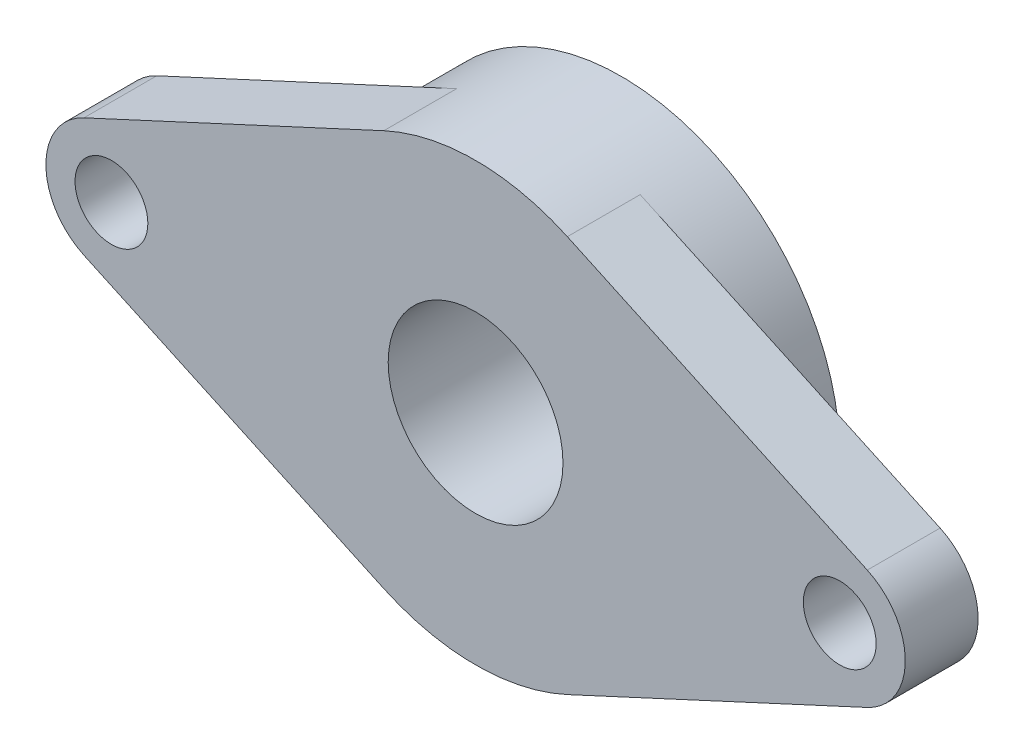
ISO-10303-21;
HEADER;
FILE_DESCRIPTION(('STEP AP214'),'2;1');
FILE_NAME('part.step','',(''),(''),'','','');
FILE_SCHEMA(('AUTOMOTIVE_DESIGN { 1 0 10303 214 1 1 1 1 }'));
ENDSEC;
DATA;
#1=APPLICATION_CONTEXT('core data for automotive mechanical design processes');
#2=APPLICATION_PROTOCOL_DEFINITION('international standard','automotive_design',2000,#1);
#3=PRODUCT_CONTEXT('',#1,'mechanical');
#4=PRODUCT('Part','Part','',(#3));
#5=PRODUCT_RELATED_PRODUCT_CATEGORY('part','',(#4));
#6=PRODUCT_DEFINITION_FORMATION('','',#4);
#7=PRODUCT_DEFINITION_CONTEXT('part definition',#1,'design');
#8=PRODUCT_DEFINITION('design','',#6,#7);
#9=PRODUCT_DEFINITION_SHAPE('','',#8);
#10=(LENGTH_UNIT() NAMED_UNIT(*) SI_UNIT(.MILLI.,.METRE.));
#11=(NAMED_UNIT(*) PLANE_ANGLE_UNIT() SI_UNIT($,.RADIAN.));
#12=(NAMED_UNIT(*) SI_UNIT($,.STERADIAN.) SOLID_ANGLE_UNIT());
#13=UNCERTAINTY_MEASURE_WITH_UNIT(LENGTH_MEASURE(1.E-05),#10,'distance_accuracy_value','');
#14=(GEOMETRIC_REPRESENTATION_CONTEXT(3) GLOBAL_UNCERTAINTY_ASSIGNED_CONTEXT((#13)) GLOBAL_UNIT_ASSIGNED_CONTEXT((#10,
#11,#12)) REPRESENTATION_CONTEXT('',''));
#15=CARTESIAN_POINT('',(0.,0.,0.));
#16=DIRECTION('',(0.,0.,1.));
#17=DIRECTION('',(1.,0.,0.));
#18=AXIS2_PLACEMENT_3D('',#15,#16,#17);
#19=CARTESIAN_POINT('',(0.,0.,0.201945205760562));
#20=DIRECTION('',(0.,0.,1.));
#21=DIRECTION('',(1.,0.,0.));
#22=AXIS2_PLACEMENT_3D('',#19,#20,#21);
#23=PLANE('',#22);
#24=CARTESIAN_POINT('',(0.,0.,0.201945205760562));
#25=DIRECTION('',(0.,0.,-1.));
#26=DIRECTION('',(-1.,0.,0.));
#27=AXIS2_PLACEMENT_3D('',#24,#25,#26);
#28=CIRCLE('',#27,10.);
#29=CARTESIAN_POINT('',(4.2,9.07524104363074,0.201945205760562));
#30=VERTEX_POINT('',#29);
#31=CARTESIAN_POINT('',(4.2,-9.07524104363074,0.201945205760562));
#32=VERTEX_POINT('',#31);
#33=EDGE_CURVE('E11',#30,#32,#28,.T.);
#34=ORIENTED_EDGE('',*,*,#33,.F.);
#35=DIRECTION('',(-0.907524104363074,0.42,0.));
#36=VECTOR('',#35,1.);
#37=CARTESIAN_POINT('',(4.2,9.07524104363074,0.201945205760562));
#38=LINE('',#37,#36);
#39=CARTESIAN_POINT('',(17.9266666666667,2.72257231308922,0.201945205760562));
#40=VERTEX_POINT('',#39);
#41=EDGE_CURVE('E155',#40,#30,#38,.T.);
#42=ORIENTED_EDGE('',*,*,#41,.F.);
#43=CARTESIAN_POINT('',(16.6666666666667,0.,0.201945205760562));
#44=DIRECTION('',(0.,0.,1.));
#45=DIRECTION('',(1.,0.,0.));
#46=AXIS2_PLACEMENT_3D('',#43,#44,#45);
#47=CIRCLE('',#46,3.);
#48=CARTESIAN_POINT('',(17.9266666666667,-2.72257231308922,0.201945205760562));
#49=VERTEX_POINT('',#48);
#50=EDGE_CURVE('E114',#40,#49,#47,.F.);
#51=ORIENTED_EDGE('',*,*,#50,.T.);
#52=DIRECTION('',(-0.907524104363074,-0.42,0.));
#53=VECTOR('',#52,1.);
#54=CARTESIAN_POINT('',(4.2,-9.07524104363074,0.201945205760562));
#55=LINE('',#54,#53);
#56=EDGE_CURVE('E152',#49,#32,#55,.T.);
#57=ORIENTED_EDGE('',*,*,#56,.T.);
#58=EDGE_LOOP('',(#34,#42,#51,#57));
#59=FACE_BOUND('',#58,.T.);
#60=CARTESIAN_POINT('',(16.6666666666667,0.,0.201945205760562));
#61=DIRECTION('',(0.,0.,1.));
#62=DIRECTION('',(1.,0.,0.));
#63=AXIS2_PLACEMENT_3D('',#60,#61,#62);
#64=CIRCLE('',#63,1.66666666666667);
#65=CARTESIAN_POINT('',(18.3333333333333,0.,0.201945205760562));
#66=VERTEX_POINT('',#65);
#67=EDGE_CURVE('E160',#66,#66,#64,.F.);
#68=ORIENTED_EDGE('',*,*,#67,.F.);
#69=EDGE_LOOP('',(#68));
#70=FACE_BOUND('',#69,.T.);
#71=ADVANCED_FACE('F36',(#59,#70),#23,.F.);
#72=CARTESIAN_POINT('',(-4.2,9.07524104363074,3.53527853909389));
#73=DIRECTION('',(-0.42,0.907524104363074,0.));
#74=DIRECTION('',(-0.907524104363074,-0.42,0.));
#75=AXIS2_PLACEMENT_3D('',#72,#73,#74);
#76=PLANE('',#75);
#77=DIRECTION('',(0.907524104363074,0.42,0.));
#78=VECTOR('',#77,1.);
#79=CARTESIAN_POINT('',(-4.2,9.07524104363074,0.201945205760562));
#80=LINE('',#79,#78);
#81=CARTESIAN_POINT('',(-17.9266666666667,2.72257231308922,0.201945205760562));
#82=VERTEX_POINT('',#81);
#83=CARTESIAN_POINT('',(-4.2,9.07524104363074,0.201945205760562));
#84=VERTEX_POINT('',#83);
#85=EDGE_CURVE('E143',#82,#84,#80,.T.);
#86=ORIENTED_EDGE('',*,*,#85,.F.);
#87=DIRECTION('',(0.,0.,-1.));
#88=VECTOR('',#87,1.);
#89=CARTESIAN_POINT('',(-17.9266666666667,2.72257231308922,3.53527853909389));
#90=LINE('',#89,#88);
#91=CARTESIAN_POINT('',(-17.9266666666667,2.72257231308922,3.53527853909389));
#92=VERTEX_POINT('',#91);
#93=EDGE_CURVE('E40',#92,#82,#90,.T.);
#94=ORIENTED_EDGE('',*,*,#93,.F.);
#95=DIRECTION('',(0.907524104363074,0.42,0.));
#96=VECTOR('',#95,1.);
#97=CARTESIAN_POINT('',(-4.2,9.07524104363074,3.53527853909389));
#98=LINE('',#97,#96);
#99=CARTESIAN_POINT('',(-4.2,9.07524104363074,3.53527853909389));
#100=VERTEX_POINT('',#99);
#101=EDGE_CURVE('E163',#92,#100,#98,.T.);
#102=ORIENTED_EDGE('',*,*,#101,.T.);
#103=DIRECTION('',(0.,0.,-1.));
#104=VECTOR('',#103,1.);
#105=CARTESIAN_POINT('',(-4.2,9.07524104363074,3.53527853909389));
#106=LINE('',#105,#104);
#107=EDGE_CURVE('E142',#100,#84,#106,.T.);
#108=ORIENTED_EDGE('',*,*,#107,.T.);
#109=EDGE_LOOP('',(#86,#94,#102,#108));
#110=FACE_BOUND('',#109,.T.);
#111=ADVANCED_FACE('F38',(#110),#76,.T.);
#112=CARTESIAN_POINT('',(-16.6666666666667,0.,3.53527853909389));
#113=DIRECTION('',(0.,0.,-1.));
#114=DIRECTION('',(-1.,0.,0.));
#115=AXIS2_PLACEMENT_3D('',#112,#113,#114);
#116=CYLINDRICAL_SURFACE('',#115,3.);
#117=CARTESIAN_POINT('',(-16.6666666666667,0.,0.201945205760562));
#118=DIRECTION('',(0.,0.,1.));
#119=DIRECTION('',(1.,0.,0.));
#120=AXIS2_PLACEMENT_3D('',#117,#118,#119);
#121=CIRCLE('',#120,3.);
#122=CARTESIAN_POINT('',(-17.9266666666667,-2.72257231308922,0.201945205760562));
#123=VERTEX_POINT('',#122);
#124=EDGE_CURVE('E146',#82,#123,#121,.T.);
#125=ORIENTED_EDGE('',*,*,#124,.T.);
#126=DIRECTION('',(0.,0.,-1.));
#127=VECTOR('',#126,1.);
#128=CARTESIAN_POINT('',(-17.9266666666667,-2.72257231308922,3.53527853909389));
#129=LINE('',#128,#127);
#130=CARTESIAN_POINT('',(-17.9266666666667,-2.72257231308922,3.53527853909389));
#131=VERTEX_POINT('',#130);
#132=EDGE_CURVE('E172',#131,#123,#129,.T.);
#133=ORIENTED_EDGE('',*,*,#132,.F.);
#134=CARTESIAN_POINT('',(-16.6666666666667,0.,3.53527853909389));
#135=DIRECTION('',(0.,0.,1.));
#136=DIRECTION('',(1.,0.,0.));
#137=AXIS2_PLACEMENT_3D('',#134,#135,#136);
#138=CIRCLE('',#137,3.);
#139=EDGE_CURVE('E186',#92,#131,#138,.T.);
#140=ORIENTED_EDGE('',*,*,#139,.F.);
#141=ORIENTED_EDGE('',*,*,#93,.T.);
#142=EDGE_LOOP('',(#125,#133,#140,#141));
#143=FACE_BOUND('',#142,.T.);
#144=ADVANCED_FACE('F198',(#143),#116,.T.);
#145=CARTESIAN_POINT('',(-4.2,-9.07524104363074,3.53527853909389));
#146=DIRECTION('',(0.42,0.907524104363074,0.));
#147=DIRECTION('',(-0.907524104363074,0.42,0.));
#148=AXIS2_PLACEMENT_3D('',#145,#146,#147);
#149=PLANE('',#148);
#150=DIRECTION('',(0.907524104363074,-0.42,0.));
#151=VECTOR('',#150,1.);
#152=CARTESIAN_POINT('',(-4.2,-9.07524104363074,0.201945205760562));
#153=LINE('',#152,#151);
#154=CARTESIAN_POINT('',(-4.2,-9.07524104363074,0.201945205760562));
#155=VERTEX_POINT('',#154);
#156=EDGE_CURVE('E149',#123,#155,#153,.T.);
#157=ORIENTED_EDGE('',*,*,#156,.T.);
#158=DIRECTION('',(0.,0.,-1.));
#159=VECTOR('',#158,1.);
#160=CARTESIAN_POINT('',(-4.2,-9.07524104363074,3.53527853909389));
#161=LINE('',#160,#159);
#162=CARTESIAN_POINT('',(-4.2,-9.07524104363074,3.53527853909389));
#163=VERTEX_POINT('',#162);
#164=EDGE_CURVE('E170',#163,#155,#161,.T.);
#165=ORIENTED_EDGE('',*,*,#164,.F.);
#166=DIRECTION('',(0.907524104363074,-0.42,0.));
#167=VECTOR('',#166,1.);
#168=CARTESIAN_POINT('',(-4.2,-9.07524104363074,3.53527853909389));
#169=LINE('',#168,#167);
#170=EDGE_CURVE('E188',#131,#163,#169,.T.);
#171=ORIENTED_EDGE('',*,*,#170,.F.);
#172=ORIENTED_EDGE('',*,*,#132,.T.);
#173=EDGE_LOOP('',(#157,#165,#171,#172));
#174=FACE_BOUND('',#173,.T.);
#175=ADVANCED_FACE('F199',(#174),#149,.F.);
#176=CARTESIAN_POINT('',(4.2,-9.07524104363074,3.53527853909389));
#177=DIRECTION('',(0.42,-0.907524104363074,0.));
#178=DIRECTION('',(0.907524104363074,0.42,0.));
#179=AXIS2_PLACEMENT_3D('',#176,#177,#178);
#180=PLANE('',#179);
#181=ORIENTED_EDGE('',*,*,#56,.F.);
#182=DIRECTION('',(0.,0.,-1.));
#183=VECTOR('',#182,1.);
#184=CARTESIAN_POINT('',(17.9266666666667,-2.72257231308922,3.53527853909389));
#185=LINE('',#184,#183);
#186=CARTESIAN_POINT('',(17.9266666666667,-2.72257231308922,3.53527853909389));
#187=VERTEX_POINT('',#186);
#188=EDGE_CURVE('E115',#187,#49,#185,.T.);
#189=ORIENTED_EDGE('',*,*,#188,.F.);
#190=DIRECTION('',(-0.907524104363074,-0.42,0.));
#191=VECTOR('',#190,1.);
#192=CARTESIAN_POINT('',(4.2,-9.07524104363074,3.53527853909389));
#193=LINE('',#192,#191);
#194=CARTESIAN_POINT('',(4.2,-9.07524104363074,3.53527853909389));
#195=VERTEX_POINT('',#194);
#196=EDGE_CURVE('E127',#187,#195,#193,.T.);
#197=ORIENTED_EDGE('',*,*,#196,.T.);
#198=DIRECTION('',(0.,0.,-1.));
#199=VECTOR('',#198,1.);
#200=CARTESIAN_POINT('',(4.2,-9.07524104363074,3.53527853909389));
#201=LINE('',#200,#199);
#202=EDGE_CURVE('E168',#195,#32,#201,.T.);
#203=ORIENTED_EDGE('',*,*,#202,.T.);
#204=EDGE_LOOP('',(#181,#189,#197,#203));
#205=FACE_BOUND('',#204,.T.);
#206=ADVANCED_FACE('F196',(#205),#180,.T.);
#207=CARTESIAN_POINT('',(16.6666666666667,0.,3.53527853909389));
#208=DIRECTION('',(0.,0.,-1.));
#209=DIRECTION('',(-1.,0.,0.));
#210=AXIS2_PLACEMENT_3D('',#207,#208,#209);
#211=CYLINDRICAL_SURFACE('',#210,3.);
#212=ORIENTED_EDGE('',*,*,#50,.F.);
#213=DIRECTION('',(0.,0.,-1.));
#214=VECTOR('',#213,1.);
#215=CARTESIAN_POINT('',(17.9266666666667,2.72257231308922,3.53527853909389));
#216=LINE('',#215,#214);
#217=CARTESIAN_POINT('',(17.9266666666667,2.72257231308922,3.53527853909389));
#218=VERTEX_POINT('',#217);
#219=EDGE_CURVE('E82',#218,#40,#216,.T.);
#220=ORIENTED_EDGE('',*,*,#219,.F.);
#221=CARTESIAN_POINT('',(16.6666666666667,0.,3.53527853909389));
#222=DIRECTION('',(0.,0.,1.));
#223=DIRECTION('',(1.,0.,0.));
#224=AXIS2_PLACEMENT_3D('',#221,#222,#223);
#225=CIRCLE('',#224,3.);
#226=EDGE_CURVE('E112',#218,#187,#225,.F.);
#227=ORIENTED_EDGE('',*,*,#226,.T.);
#228=ORIENTED_EDGE('',*,*,#188,.T.);
#229=EDGE_LOOP('',(#212,#220,#227,#228));
#230=FACE_BOUND('',#229,.T.);
#231=ADVANCED_FACE('F110',(#230),#211,.T.);
#232=CARTESIAN_POINT('',(4.2,9.07524104363074,3.53527853909389));
#233=DIRECTION('',(-0.42,-0.907524104363074,0.));
#234=DIRECTION('',(0.907524104363074,-0.42,0.));
#235=AXIS2_PLACEMENT_3D('',#232,#233,#234);
#236=PLANE('',#235);
#237=ORIENTED_EDGE('',*,*,#41,.T.);
#238=DIRECTION('',(0.,0.,-1.));
#239=VECTOR('',#238,1.);
#240=CARTESIAN_POINT('',(4.2,9.07524104363074,3.53527853909389));
#241=LINE('',#240,#239);
#242=CARTESIAN_POINT('',(4.2,9.07524104363074,3.53527853909389));
#243=VERTEX_POINT('',#242);
#244=EDGE_CURVE('E116',#243,#30,#241,.T.);
#245=ORIENTED_EDGE('',*,*,#244,.F.);
#246=DIRECTION('',(-0.907524104363074,0.42,0.));
#247=VECTOR('',#246,1.);
#248=CARTESIAN_POINT('',(4.2,9.07524104363074,3.53527853909389));
#249=LINE('',#248,#247);
#250=EDGE_CURVE('E119',#218,#243,#249,.T.);
#251=ORIENTED_EDGE('',*,*,#250,.F.);
#252=ORIENTED_EDGE('',*,*,#219,.T.);
#253=EDGE_LOOP('',(#237,#245,#251,#252));
#254=FACE_BOUND('',#253,.T.);
#255=ADVANCED_FACE('F120',(#254),#236,.F.);
#256=CARTESIAN_POINT('',(-16.6666666666667,0.,3.53527853909389));
#257=DIRECTION('',(0.,0.,-1.));
#258=DIRECTION('',(-1.,0.,0.));
#259=AXIS2_PLACEMENT_3D('',#256,#257,#258);
#260=CYLINDRICAL_SURFACE('',#259,1.66666666666667);
#261=CARTESIAN_POINT('',(-16.6666666666667,0.,3.53527853909389));
#262=DIRECTION('',(0.,0.,1.));
#263=DIRECTION('',(1.,0.,0.));
#264=AXIS2_PLACEMENT_3D('',#261,#262,#263);
#265=CIRCLE('',#264,1.66666666666667);
#266=CARTESIAN_POINT('',(-15.,0.,3.53527853909389));
#267=VERTEX_POINT('',#266);
#268=EDGE_CURVE('E136',#267,#267,#265,.T.);
#269=ORIENTED_EDGE('',*,*,#268,.T.);
#270=EDGE_LOOP('',(#269));
#271=FACE_BOUND('',#270,.T.);
#272=CARTESIAN_POINT('',(-16.6666666666667,0.,0.201945205760562));
#273=DIRECTION('',(0.,0.,1.));
#274=DIRECTION('',(1.,0.,0.));
#275=AXIS2_PLACEMENT_3D('',#272,#273,#274);
#276=CIRCLE('',#275,1.66666666666667);
#277=CARTESIAN_POINT('',(-15.,0.,0.201945205760562));
#278=VERTEX_POINT('',#277);
#279=EDGE_CURVE('E157',#278,#278,#276,.T.);
#280=ORIENTED_EDGE('',*,*,#279,.F.);
#281=EDGE_LOOP('',(#280));
#282=FACE_BOUND('',#281,.T.);
#283=ADVANCED_FACE('F208',(#271,#282),#260,.F.);
#284=CARTESIAN_POINT('',(0.,0.,3.53527853909389));
#285=DIRECTION('',(0.,0.,-1.));
#286=DIRECTION('',(-1.,0.,0.));
#287=AXIS2_PLACEMENT_3D('',#284,#285,#286);
#288=CYLINDRICAL_SURFACE('',#287,4.);
#289=CARTESIAN_POINT('',(0.,0.,3.53527853909389));
#290=DIRECTION('',(0.,0.,1.));
#291=DIRECTION('',(1.,0.,0.));
#292=AXIS2_PLACEMENT_3D('',#289,#290,#291);
#293=CIRCLE('',#292,4.);
#294=CARTESIAN_POINT('',(4.,0.,3.53527853909389));
#295=VERTEX_POINT('',#294);
#296=EDGE_CURVE('E133',#295,#295,#293,.T.);
#297=ORIENTED_EDGE('',*,*,#296,.T.);
#298=EDGE_LOOP('',(#297));
#299=FACE_BOUND('',#298,.T.);
#300=CARTESIAN_POINT('',(0.,0.,-3.13138812757277));
#301=DIRECTION('',(0.,0.,-1.));
#302=DIRECTION('',(-1.,0.,0.));
#303=AXIS2_PLACEMENT_3D('',#300,#301,#302);
#304=CIRCLE('',#303,4.);
#305=CARTESIAN_POINT('',(-4.,0.,-3.13138812757277));
#306=VERTEX_POINT('',#305);
#307=EDGE_CURVE('E323',#306,#306,#304,.T.);
#308=ORIENTED_EDGE('',*,*,#307,.T.);
#309=EDGE_LOOP('',(#308));
#310=FACE_BOUND('',#309,.T.);
#311=ADVANCED_FACE('F210',(#299,#310),#288,.F.);
#312=CARTESIAN_POINT('',(0.,0.,3.53527853909389));
#313=DIRECTION('',(0.,0.,-1.));
#314=DIRECTION('',(-1.,0.,0.));
#315=AXIS2_PLACEMENT_3D('',#312,#313,#314);
#316=CYLINDRICAL_SURFACE('',#315,10.);
#317=ORIENTED_EDGE('',*,*,#244,.T.);
#318=ORIENTED_EDGE('',*,*,#33,.T.);
#319=ORIENTED_EDGE('',*,*,#202,.F.);
#320=CARTESIAN_POINT('',(0.,0.,3.53527853909389));
#321=DIRECTION('',(0.,0.,1.));
#322=DIRECTION('',(1.,0.,0.));
#323=AXIS2_PLACEMENT_3D('',#320,#321,#322);
#324=CIRCLE('',#323,10.);
#325=EDGE_CURVE('E129',#163,#195,#324,.T.);
#326=ORIENTED_EDGE('',*,*,#325,.F.);
#327=ORIENTED_EDGE('',*,*,#164,.T.);
#328=EDGE_CURVE('E46',#155,#84,#28,.T.);
#329=ORIENTED_EDGE('',*,*,#328,.T.);
#330=ORIENTED_EDGE('',*,*,#107,.F.);
#331=EDGE_CURVE('E55',#243,#100,#324,.T.);
#332=ORIENTED_EDGE('',*,*,#331,.F.);
#333=EDGE_LOOP('',(#317,#318,#319,#326,#327,#329,#330,#332));
#334=FACE_BOUND('',#333,.T.);
#335=CARTESIAN_POINT('',(0.,0.,-3.13138812757277));
#336=DIRECTION('',(0.,0.,-1.));
#337=DIRECTION('',(-1.,0.,0.));
#338=AXIS2_PLACEMENT_3D('',#335,#336,#337);
#339=CIRCLE('',#338,10.);
#340=CARTESIAN_POINT('',(-10.,0.,-3.13138812757277));
#341=VERTEX_POINT('',#340);
#342=EDGE_CURVE('E147',#341,#341,#339,.T.);
#343=ORIENTED_EDGE('',*,*,#342,.F.);
#344=EDGE_LOOP('',(#343));
#345=FACE_BOUND('',#344,.T.);
#346=ADVANCED_FACE('F192',(#334,#345),#316,.T.);
#347=CARTESIAN_POINT('',(16.6666666666667,0.,3.53527853909389));
#348=DIRECTION('',(0.,0.,-1.));
#349=DIRECTION('',(-1.,0.,0.));
#350=AXIS2_PLACEMENT_3D('',#347,#348,#349);
#351=CYLINDRICAL_SURFACE('',#350,1.66666666666667);
#352=CARTESIAN_POINT('',(16.6666666666667,0.,3.53527853909389));
#353=DIRECTION('',(0.,0.,1.));
#354=DIRECTION('',(1.,0.,0.));
#355=AXIS2_PLACEMENT_3D('',#352,#353,#354);
#356=CIRCLE('',#355,1.66666666666667);
#357=CARTESIAN_POINT('',(18.3333333333333,0.,3.53527853909389));
#358=VERTEX_POINT('',#357);
#359=EDGE_CURVE('E139',#358,#358,#356,.F.);
#360=ORIENTED_EDGE('',*,*,#359,.F.);
#361=EDGE_LOOP('',(#360));
#362=FACE_BOUND('',#361,.T.);
#363=ORIENTED_EDGE('',*,*,#67,.T.);
#364=EDGE_LOOP('',(#363));
#365=FACE_BOUND('',#364,.T.);
#366=ADVANCED_FACE('F227',(#362,#365),#351,.F.);
#367=CARTESIAN_POINT('',(0.,0.,3.53527853909389));
#368=DIRECTION('',(0.,0.,1.));
#369=DIRECTION('',(1.,0.,0.));
#370=AXIS2_PLACEMENT_3D('',#367,#368,#369);
#371=PLANE('',#370);
#372=ORIENTED_EDGE('',*,*,#101,.F.);
#373=ORIENTED_EDGE('',*,*,#139,.T.);
#374=ORIENTED_EDGE('',*,*,#170,.T.);
#375=ORIENTED_EDGE('',*,*,#325,.T.);
#376=ORIENTED_EDGE('',*,*,#196,.F.);
#377=ORIENTED_EDGE('',*,*,#226,.F.);
#378=ORIENTED_EDGE('',*,*,#250,.T.);
#379=ORIENTED_EDGE('',*,*,#331,.T.);
#380=EDGE_LOOP('',(#372,#373,#374,#375,#376,#377,#378,#379));
#381=FACE_BOUND('',#380,.T.);
#382=ORIENTED_EDGE('',*,*,#296,.F.);
#383=EDGE_LOOP('',(#382));
#384=FACE_BOUND('',#383,.T.);
#385=ORIENTED_EDGE('',*,*,#268,.F.);
#386=EDGE_LOOP('',(#385));
#387=FACE_BOUND('',#386,.T.);
#388=ORIENTED_EDGE('',*,*,#359,.T.);
#389=EDGE_LOOP('',(#388));
#390=FACE_BOUND('',#389,.T.);
#391=ADVANCED_FACE('F124',(#381,#384,#387,#390),#371,.T.);
#392=ORIENTED_EDGE('',*,*,#328,.F.);
#393=ORIENTED_EDGE('',*,*,#156,.F.);
#394=ORIENTED_EDGE('',*,*,#124,.F.);
#395=ORIENTED_EDGE('',*,*,#85,.T.);
#396=EDGE_LOOP('',(#392,#393,#394,#395));
#397=FACE_BOUND('',#396,.T.);
#398=ORIENTED_EDGE('',*,*,#279,.T.);
#399=EDGE_LOOP('',(#398));
#400=FACE_BOUND('',#399,.T.);
#401=ADVANCED_FACE('F201',(#397,#400),#23,.F.);
#402=CARTESIAN_POINT('',(0.,0.,-3.13138812757277));
#403=DIRECTION('',(0.,0.,-1.));
#404=DIRECTION('',(-1.,0.,0.));
#405=AXIS2_PLACEMENT_3D('',#402,#403,#404);
#406=PLANE('',#405);
#407=ORIENTED_EDGE('',*,*,#342,.T.);
#408=EDGE_LOOP('',(#407));
#409=FACE_BOUND('',#408,.T.);
#410=ORIENTED_EDGE('',*,*,#307,.F.);
#411=EDGE_LOOP('',(#410));
#412=FACE_BOUND('',#411,.T.);
#413=ADVANCED_FACE('F204',(#409,#412),#406,.T.);
#414=CLOSED_SHELL('',(#71,#111,#144,#175,#206,#231,#255,#283,#311,#346,#366,#391,#401,#413));
#415=MANIFOLD_SOLID_BREP('B2',#414);
#416=ADVANCED_BREP_SHAPE_REPRESENTATION('',(#18,#415),#14);
#417=SHAPE_DEFINITION_REPRESENTATION(#9,#416);
ENDSEC;
END-ISO-10303-21;
